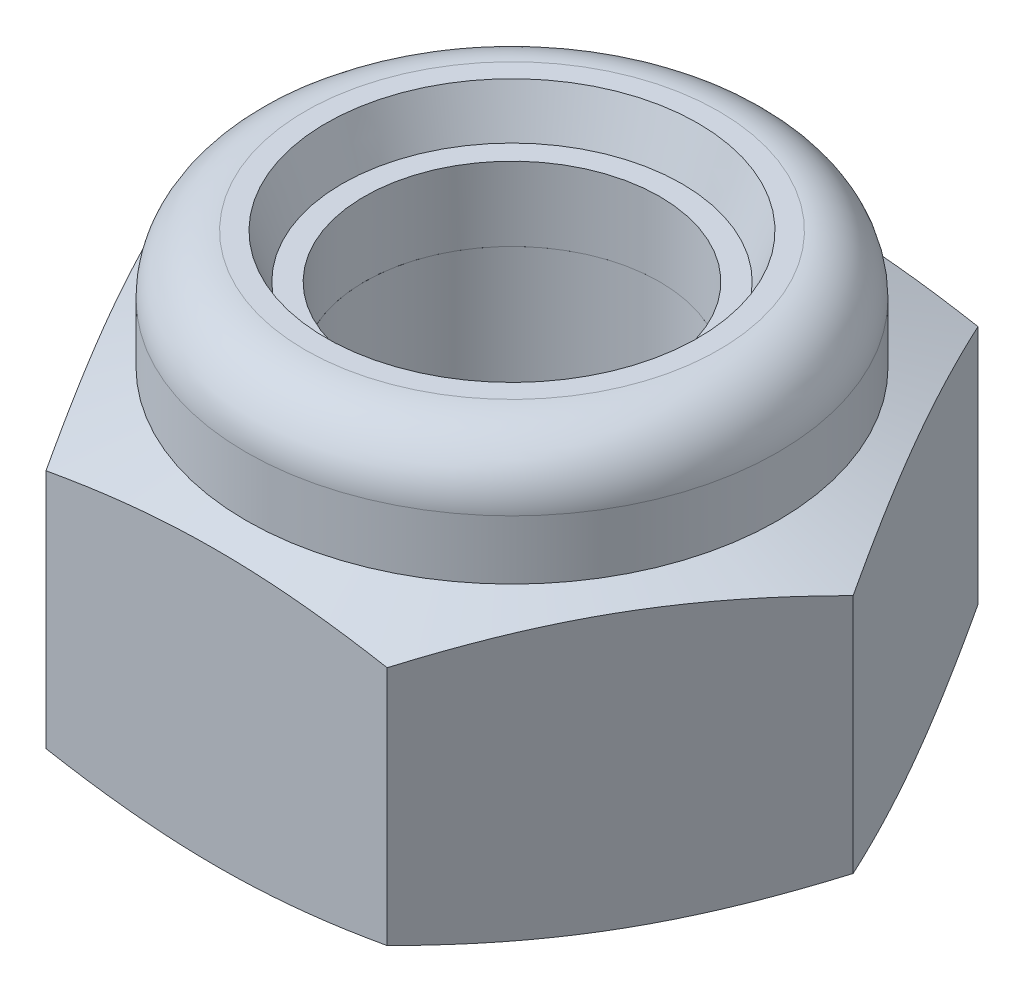
ISO-10303-21;
HEADER;
FILE_DESCRIPTION(('STEP AP214'),'2;1');
FILE_NAME('part.step','',(''),(''),'','','');
FILE_SCHEMA(('AUTOMOTIVE_DESIGN { 1 0 10303 214 1 1 1 1 }'));
ENDSEC;
DATA;
#1=APPLICATION_CONTEXT('core data for automotive mechanical design processes');
#2=APPLICATION_PROTOCOL_DEFINITION('international standard','automotive_design',2000,#1);
#3=PRODUCT_CONTEXT('',#1,'mechanical');
#4=PRODUCT('Part','Part','',(#3));
#5=PRODUCT_RELATED_PRODUCT_CATEGORY('part','',(#4));
#6=PRODUCT_DEFINITION_FORMATION('','',#4);
#7=PRODUCT_DEFINITION_CONTEXT('part definition',#1,'design');
#8=PRODUCT_DEFINITION('design','',#6,#7);
#9=PRODUCT_DEFINITION_SHAPE('','',#8);
#10=(LENGTH_UNIT() NAMED_UNIT(*) SI_UNIT(.MILLI.,.METRE.));
#11=(NAMED_UNIT(*) PLANE_ANGLE_UNIT() SI_UNIT($,.RADIAN.));
#12=(NAMED_UNIT(*) SI_UNIT($,.STERADIAN.) SOLID_ANGLE_UNIT());
#13=UNCERTAINTY_MEASURE_WITH_UNIT(LENGTH_MEASURE(1.E-05),#10,'distance_accuracy_value','');
#14=(GEOMETRIC_REPRESENTATION_CONTEXT(3) GLOBAL_UNCERTAINTY_ASSIGNED_CONTEXT((#13)) GLOBAL_UNIT_ASSIGNED_CONTEXT((#10,
#11,#12)) REPRESENTATION_CONTEXT('',''));
#15=CARTESIAN_POINT('',(0.,0.,0.));
#16=DIRECTION('',(0.,0.,1.));
#17=DIRECTION('',(1.,0.,0.));
#18=AXIS2_PLACEMENT_3D('',#15,#16,#17);
#19=CARTESIAN_POINT('',(0.,2.,0.));
#20=DIRECTION('',(0.,1.,0.));
#21=DIRECTION('',(0.,0.,1.));
#22=AXIS2_PLACEMENT_3D('',#19,#20,#21);
#23=PLANE('',#22);
#24=CARTESIAN_POINT('',(0.,2.,0.));
#25=DIRECTION('',(0.,1.,0.));
#26=DIRECTION('',(0.,0.,1.));
#27=AXIS2_PLACEMENT_3D('',#24,#25,#26);
#28=CIRCLE('',#27,1.3);
#29=CARTESIAN_POINT('',(0.,2.,1.3));
#30=VERTEX_POINT('',#29);
#31=EDGE_CURVE('E56',#30,#30,#28,.T.);
#32=ORIENTED_EDGE('',*,*,#31,.F.);
#33=EDGE_LOOP('',(#32));
#34=FACE_BOUND('',#33,.T.);
#35=CARTESIAN_POINT('',(0.,2.,0.));
#36=DIRECTION('',(0.,1.,0.));
#37=DIRECTION('',(0.,0.,1.));
#38=AXIS2_PLACEMENT_3D('',#35,#36,#37);
#39=CIRCLE('',#38,1.);
#40=CARTESIAN_POINT('',(0.,2.,1.));
#41=VERTEX_POINT('',#40);
#42=EDGE_CURVE('E65',#41,#41,#39,.T.);
#43=ORIENTED_EDGE('',*,*,#42,.T.);
#44=EDGE_LOOP('',(#43));
#45=FACE_BOUND('',#44,.T.);
#46=ADVANCED_FACE('F49',(#34,#45),#23,.F.);
#47=CARTESIAN_POINT('',(0.,6.17695526217005,0.));
#48=DIRECTION('',(0.,-1.,0.));
#49=DIRECTION('',(0.,0.,-1.));
#50=AXIS2_PLACEMENT_3D('',#47,#48,#49);
#51=CYLINDRICAL_SURFACE('',#50,1.3);
#52=CARTESIAN_POINT('',(0.,2.5,0.));
#53=DIRECTION('',(0.,-1.,0.));
#54=DIRECTION('',(0.,0.,-1.));
#55=AXIS2_PLACEMENT_3D('',#52,#53,#54);
#56=CIRCLE('',#55,1.3);
#57=CARTESIAN_POINT('',(0.,2.5,-1.3));
#58=VERTEX_POINT('',#57);
#59=EDGE_CURVE('E60',#58,#58,#56,.T.);
#60=ORIENTED_EDGE('',*,*,#59,.T.);
#61=EDGE_LOOP('',(#60));
#62=FACE_BOUND('',#61,.T.);
#63=ORIENTED_EDGE('',*,*,#31,.T.);
#64=EDGE_LOOP('',(#63));
#65=FACE_BOUND('',#64,.T.);
#66=ADVANCED_FACE('F73',(#62,#65),#51,.T.);
#67=CARTESIAN_POINT('',(0.,6.17695526217005,0.));
#68=DIRECTION('',(0.,-1.,0.));
#69=DIRECTION('',(0.,0.,-1.));
#70=AXIS2_PLACEMENT_3D('',#67,#68,#69);
#71=CYLINDRICAL_SURFACE('',#70,1.);
#72=CARTESIAN_POINT('',(0.,2.5,0.));
#73=DIRECTION('',(0.,-1.,0.));
#74=DIRECTION('',(0.,0.,-1.));
#75=AXIS2_PLACEMENT_3D('',#72,#73,#74);
#76=CIRCLE('',#75,1.);
#77=CARTESIAN_POINT('',(0.,2.5,-1.));
#78=VERTEX_POINT('',#77);
#79=EDGE_CURVE('E11',#78,#78,#76,.T.);
#80=ORIENTED_EDGE('',*,*,#79,.F.);
#81=EDGE_LOOP('',(#80));
#82=FACE_BOUND('',#81,.T.);
#83=ORIENTED_EDGE('',*,*,#42,.F.);
#84=EDGE_LOOP('',(#83));
#85=FACE_BOUND('',#84,.T.);
#86=ADVANCED_FACE('F71',(#82,#85),#71,.F.);
#87=CARTESIAN_POINT('',(1.3,2.5,0.));
#88=DIRECTION('',(0.,-1.,0.));
#89=DIRECTION('',(0.,0.,-1.));
#90=AXIS2_PLACEMENT_3D('',#87,#88,#89);
#91=PLANE('',#90);
#92=ORIENTED_EDGE('',*,*,#79,.T.);
#93=EDGE_LOOP('',(#92));
#94=FACE_BOUND('',#93,.T.);
#95=ORIENTED_EDGE('',*,*,#59,.F.);
#96=EDGE_LOOP('',(#95));
#97=FACE_BOUND('',#96,.T.);
#98=ADVANCED_FACE('F51',(#94,#97),#91,.F.);
#99=CLOSED_SHELL('',(#46,#66,#86,#98));
#100=MANIFOLD_SOLID_BREP('B2',#99);
#101=CARTESIAN_POINT('',(0.,0.173205080756889,0.));
#102=DIRECTION('',(0.,-1.,0.));
#103=DIRECTION('',(0.,0.,-1.));
#104=AXIS2_PLACEMENT_3D('',#101,#102,#103);
#105=CONICAL_SURFACE('',#104,1.,1.04719755119659);
#106=CARTESIAN_POINT('',(0.,0.,0.));
#107=DIRECTION('',(0.,-1.,0.));
#108=DIRECTION('',(0.,0.,-1.));
#109=AXIS2_PLACEMENT_3D('',#106,#107,#108);
#110=CIRCLE('',#109,1.3);
#111=CARTESIAN_POINT('',(0.,0.,-1.3));
#112=VERTEX_POINT('',#111);
#113=EDGE_CURVE('E220',#112,#112,#110,.T.);
#114=ORIENTED_EDGE('',*,*,#113,.T.);
#115=EDGE_LOOP('',(#114));
#116=FACE_BOUND('',#115,.T.);
#117=CARTESIAN_POINT('',(0.,0.173205080756889,0.));
#118=DIRECTION('',(0.,-1.,0.));
#119=DIRECTION('',(0.,0.,-1.));
#120=AXIS2_PLACEMENT_3D('',#117,#118,#119);
#121=CIRCLE('',#120,1.);
#122=CARTESIAN_POINT('',(0.,0.173205080756889,-1.));
#123=VERTEX_POINT('',#122);
#124=EDGE_CURVE('E191',#123,#123,#121,.T.);
#125=ORIENTED_EDGE('',*,*,#124,.F.);
#126=EDGE_LOOP('',(#125));
#127=FACE_BOUND('',#126,.T.);
#128=ADVANCED_FACE('F111',(#116,#127),#105,.F.);
#129=CARTESIAN_POINT('',(1.3,0.,0.));
#130=DIRECTION('',(0.,-1.,0.));
#131=DIRECTION('',(0.,0.,-1.));
#132=AXIS2_PLACEMENT_3D('',#129,#130,#131);
#133=PLANE('',#132);
#134=CARTESIAN_POINT('',(0.,0.,0.));
#135=DIRECTION('',(0.,-1.,0.));
#136=DIRECTION('',(0.,0.,-1.));
#137=AXIS2_PLACEMENT_3D('',#134,#135,#136);
#138=CIRCLE('',#137,1.8);
#139=CARTESIAN_POINT('',(0.,0.,-1.8));
#140=VERTEX_POINT('',#139);
#141=EDGE_CURVE('E314',#140,#140,#138,.T.);
#142=ORIENTED_EDGE('',*,*,#141,.T.);
#143=EDGE_LOOP('',(#142));
#144=FACE_BOUND('',#143,.T.);
#145=ORIENTED_EDGE('',*,*,#113,.F.);
#146=EDGE_LOOP('',(#145));
#147=FACE_BOUND('',#146,.T.);
#148=ADVANCED_FACE('F321',(#144,#147),#133,.T.);
#149=CARTESIAN_POINT('',(0.,-0.041635430402974,0.));
#150=DIRECTION('',(0.,-1.,0.));
#151=DIRECTION('',(0.,0.,-1.));
#152=AXIS2_PLACEMENT_3D('',#149,#150,#151);
#153=CYLINDRICAL_SURFACE('',#152,1.8);
#154=CARTESIAN_POINT('',(0.,2.,0.));
#155=DIRECTION('',(0.,-1.,0.));
#156=DIRECTION('',(0.,0.,-1.));
#157=AXIS2_PLACEMENT_3D('',#154,#155,#156);
#158=CIRCLE('',#157,1.8);
#159=CARTESIAN_POINT('',(0.,2.,-1.8));
#160=VERTEX_POINT('',#159);
#161=EDGE_CURVE('E312',#160,#160,#158,.T.);
#162=ORIENTED_EDGE('',*,*,#161,.F.);
#163=EDGE_LOOP('',(#162));
#164=FACE_BOUND('',#163,.T.);
#165=CARTESIAN_POINT('',(0.,2.4,0.));
#166=DIRECTION('',(0.,-1.,0.));
#167=DIRECTION('',(0.,0.,-1.));
#168=AXIS2_PLACEMENT_3D('',#165,#166,#167);
#169=CIRCLE('',#168,1.8);
#170=CARTESIAN_POINT('',(0.,2.4,-1.8));
#171=VERTEX_POINT('',#170);
#172=EDGE_CURVE('E217',#171,#171,#169,.T.);
#173=ORIENTED_EDGE('',*,*,#172,.T.);
#174=EDGE_LOOP('',(#173));
#175=FACE_BOUND('',#174,.T.);
#176=ADVANCED_FACE('F324',(#164,#175),#153,.T.);
#177=CARTESIAN_POINT('',(0.,2.4,0.));
#178=DIRECTION('',(0.,-1.,0.));
#179=DIRECTION('',(0.,0.,-1.));
#180=AXIS2_PLACEMENT_3D('',#177,#178,#179);
#181=TOROIDAL_SURFACE('',#180,1.4,0.4);
#182=CARTESIAN_POINT('',(0.,2.8,0.));
#183=DIRECTION('',(0.,-1.,0.));
#184=DIRECTION('',(0.,0.,-1.));
#185=AXIS2_PLACEMENT_3D('',#182,#183,#184);
#186=CIRCLE('',#185,1.4);
#187=CARTESIAN_POINT('',(0.,2.8,-1.4));
#188=VERTEX_POINT('',#187);
#189=EDGE_CURVE('E214',#188,#188,#186,.T.);
#190=ORIENTED_EDGE('',*,*,#189,.T.);
#191=EDGE_LOOP('',(#190));
#192=FACE_BOUND('',#191,.T.);
#193=ORIENTED_EDGE('',*,*,#172,.F.);
#194=EDGE_LOOP('',(#193));
#195=FACE_BOUND('',#194,.T.);
#196=ADVANCED_FACE('F362',(#192,#195),#181,.T.);
#197=CARTESIAN_POINT('',(1.4,2.8,0.));
#198=DIRECTION('',(0.,1.,0.));
#199=DIRECTION('',(0.,0.,1.));
#200=AXIS2_PLACEMENT_3D('',#197,#198,#199);
#201=PLANE('',#200);
#202=CARTESIAN_POINT('',(0.,2.8,0.));
#203=DIRECTION('',(0.,-1.,0.));
#204=DIRECTION('',(0.,0.,-1.));
#205=AXIS2_PLACEMENT_3D('',#202,#203,#204);
#206=CIRCLE('',#205,1.25919107027986);
#207=CARTESIAN_POINT('',(0.,2.8,-1.25919107027986));
#208=VERTEX_POINT('',#207);
#209=EDGE_CURVE('E211',#208,#208,#206,.T.);
#210=ORIENTED_EDGE('',*,*,#209,.T.);
#211=EDGE_LOOP('',(#210));
#212=FACE_BOUND('',#211,.T.);
#213=ORIENTED_EDGE('',*,*,#189,.F.);
#214=EDGE_LOOP('',(#213));
#215=FACE_BOUND('',#214,.T.);
#216=ADVANCED_FACE('F356',(#212,#215),#201,.T.);
#217=CARTESIAN_POINT('',(0.,2.8,0.));
#218=DIRECTION('',(0.,1.,0.));
#219=DIRECTION('',(0.,0.,1.));
#220=AXIS2_PLACEMENT_3D('',#217,#218,#219);
#221=CONICAL_SURFACE('',#220,1.25919107027986,0.349065850398862);
#222=CARTESIAN_POINT('',(0.,2.5,0.));
#223=DIRECTION('',(0.,-1.,0.));
#224=DIRECTION('',(0.,0.,-1.));
#225=AXIS2_PLACEMENT_3D('',#222,#223,#224);
#226=CIRCLE('',#225,1.15);
#227=CARTESIAN_POINT('',(0.,2.5,-1.15));
#228=VERTEX_POINT('',#227);
#229=EDGE_CURVE('E208',#228,#228,#226,.T.);
#230=ORIENTED_EDGE('',*,*,#229,.T.);
#231=EDGE_LOOP('',(#230));
#232=FACE_BOUND('',#231,.T.);
#233=ORIENTED_EDGE('',*,*,#209,.F.);
#234=EDGE_LOOP('',(#233));
#235=FACE_BOUND('',#234,.T.);
#236=ADVANCED_FACE('F350',(#232,#235),#221,.F.);
#237=CARTESIAN_POINT('',(1.3,2.5,0.));
#238=DIRECTION('',(0.,-1.,0.));
#239=DIRECTION('',(0.,0.,-1.));
#240=AXIS2_PLACEMENT_3D('',#237,#238,#239);
#241=PLANE('',#240);
#242=CARTESIAN_POINT('',(0.,2.5,0.));
#243=DIRECTION('',(0.,-1.,0.));
#244=DIRECTION('',(0.,0.,-1.));
#245=AXIS2_PLACEMENT_3D('',#242,#243,#244);
#246=CIRCLE('',#245,1.3);
#247=CARTESIAN_POINT('',(0.,2.5,-1.3));
#248=VERTEX_POINT('',#247);
#249=EDGE_CURVE('E205',#248,#248,#246,.T.);
#250=ORIENTED_EDGE('',*,*,#249,.T.);
#251=EDGE_LOOP('',(#250));
#252=FACE_BOUND('',#251,.T.);
#253=ORIENTED_EDGE('',*,*,#229,.F.);
#254=EDGE_LOOP('',(#253));
#255=FACE_BOUND('',#254,.T.);
#256=ADVANCED_FACE('F344',(#252,#255),#241,.T.);
#257=CARTESIAN_POINT('',(0.,-0.041635430402974,0.));
#258=DIRECTION('',(0.,-1.,0.));
#259=DIRECTION('',(0.,0.,-1.));
#260=AXIS2_PLACEMENT_3D('',#257,#258,#259);
#261=CYLINDRICAL_SURFACE('',#260,1.3);
#262=CARTESIAN_POINT('',(0.,2.,0.));
#263=DIRECTION('',(0.,-1.,0.));
#264=DIRECTION('',(0.,0.,-1.));
#265=AXIS2_PLACEMENT_3D('',#262,#263,#264);
#266=CIRCLE('',#265,1.3);
#267=CARTESIAN_POINT('',(0.,2.,-1.3));
#268=VERTEX_POINT('',#267);
#269=EDGE_CURVE('E202',#268,#268,#266,.T.);
#270=ORIENTED_EDGE('',*,*,#269,.T.);
#271=EDGE_LOOP('',(#270));
#272=FACE_BOUND('',#271,.T.);
#273=ORIENTED_EDGE('',*,*,#249,.F.);
#274=EDGE_LOOP('',(#273));
#275=FACE_BOUND('',#274,.T.);
#276=ADVANCED_FACE('F338',(#272,#275),#261,.F.);
#277=CARTESIAN_POINT('',(1.,2.,0.));
#278=DIRECTION('',(0.,1.,0.));
#279=DIRECTION('',(0.,0.,1.));
#280=AXIS2_PLACEMENT_3D('',#277,#278,#279);
#281=PLANE('',#280);
#282=CARTESIAN_POINT('',(0.,2.,0.));
#283=DIRECTION('',(0.,-1.,0.));
#284=DIRECTION('',(0.,0.,-1.));
#285=AXIS2_PLACEMENT_3D('',#282,#283,#284);
#286=CIRCLE('',#285,1.);
#287=CARTESIAN_POINT('',(0.,2.,-1.));
#288=VERTEX_POINT('',#287);
#289=EDGE_CURVE('E199',#288,#288,#286,.T.);
#290=ORIENTED_EDGE('',*,*,#289,.T.);
#291=EDGE_LOOP('',(#290));
#292=FACE_BOUND('',#291,.T.);
#293=ORIENTED_EDGE('',*,*,#269,.F.);
#294=EDGE_LOOP('',(#293));
#295=FACE_BOUND('',#294,.T.);
#296=ADVANCED_FACE('F333',(#292,#295),#281,.T.);
#297=CARTESIAN_POINT('',(0.,-0.041635430402974,0.));
#298=DIRECTION('',(0.,-1.,0.));
#299=DIRECTION('',(0.,0.,-1.));
#300=AXIS2_PLACEMENT_3D('',#297,#298,#299);
#301=CYLINDRICAL_SURFACE('',#300,1.);
#302=ORIENTED_EDGE('',*,*,#124,.T.);
#303=EDGE_LOOP('',(#302));
#304=FACE_BOUND('',#303,.T.);
#305=ORIENTED_EDGE('',*,*,#289,.F.);
#306=EDGE_LOOP('',(#305));
#307=FACE_BOUND('',#306,.T.);
#308=ADVANCED_FACE('F233',(#304,#307),#301,.F.);
#309=CARTESIAN_POINT('',(0.,0.,0.));
#310=DIRECTION('',(0.,1.,0.));
#311=DIRECTION('',(0.,0.,1.));
#312=AXIS2_PLACEMENT_3D('',#309,#310,#311);
#313=CONICAL_SURFACE('',#312,1.8,1.22173047639604);
#314=ORIENTED_EDGE('',*,*,#141,.F.);
#315=EDGE_LOOP('',(#314));
#316=FACE_BOUND('',#315,.T.);
#317=CARTESIAN_POINT('',(2.30951654681234,0.185448860057707,-0.000200000000000235));
#318=CARTESIAN_POINT('',(2.26168836191613,0.168032497453668,0.0826408462740325));
#319=CARTESIAN_POINT('',(2.213702437291,0.152189163754237,0.165754905772934));
#320=CARTESIAN_POINT('',(2.11741850917833,0.124315100500139,0.332523561216389));
#321=CARTESIAN_POINT('',(2.06912029137895,0.112287355790318,0.416178528359942));
#322=CARTESIAN_POINT('',(1.97274789994999,0.092832762508844,0.583100406761807));
#323=CARTESIAN_POINT('',(1.92467592830622,0.0853634711754722,0.666363504068834));
#324=CARTESIAN_POINT('',(1.82841954097686,0.0753450362594954,0.833084457476315));
#325=CARTESIAN_POINT('',(1.78023517427287,0.0727940468532388,0.916542228738157));
#326=CARTESIAN_POINT('',(1.68386644086489,0.0727940468532389,1.08345777126184));
#327=CARTESIAN_POINT('',(1.63568207416089,0.0753450362594954,1.16691554252369));
#328=CARTESIAN_POINT('',(1.53942568683153,0.0853634711754723,1.33363649593117));
#329=CARTESIAN_POINT('',(1.49135371518776,0.0928327625088441,1.41689959323819));
#330=CARTESIAN_POINT('',(1.39498132375881,0.112287355790318,1.58382147164006));
#331=CARTESIAN_POINT('',(1.34668310595943,0.124315100500139,1.66747643878361));
#332=CARTESIAN_POINT('',(1.25039917784676,0.152189163754237,1.83424509422707));
#333=CARTESIAN_POINT('',(1.20241325322162,0.168032497453668,1.91735915372597));
#334=CARTESIAN_POINT('',(1.15458506832541,0.185448860057707,2.0002));
#335=B_SPLINE_CURVE_WITH_KNOTS('',3,(#317,#318,#319,#320,#321,#322,#323,#324,#325,#326,#327,
#328,#329,#330,#331,#332,#333,#334),.UNSPECIFIED.,.F.,.F.,(4,2,2,2,2,2,2,2,4),(0.,
0.291716985835478,0.583661615412808,0.872844804843114,1.16191944356588,1.45099408228865,
1.74017727171896,2.03212190129629,2.32383888713177),.UNSPECIFIED.);
#336=CARTESIAN_POINT('',(2.3094010767585,0.185406829243244,0.));
#337=VERTEX_POINT('',#336);
#338=CARTESIAN_POINT('',(1.15470053837925,0.185406829243244,2.));
#339=VERTEX_POINT('',#338);
#340=EDGE_CURVE('E138',#337,#339,#335,.T.);
#341=ORIENTED_EDGE('',*,*,#340,.T.);
#342=CARTESIAN_POINT('',(3.47173221669845,0.803140399166297,2.));
#343=CARTESIAN_POINT('',(3.33467613121465,0.759947162321743,2.));
#344=CARTESIAN_POINT('',(3.19744874625352,0.717277491965518,2.));
#345=CARTESIAN_POINT('',(2.92248766846374,0.633488248677123,2.));
#346=CARTESIAN_POINT('',(2.78475386515635,0.592369039088497,2.));
#347=CARTESIAN_POINT('',(2.50664175666766,0.511612437333617,2.));
#348=CARTESIAN_POINT('',(2.36625443302725,0.472005890151682,2.));
#349=CARTESIAN_POINT('',(2.0846705697637,0.395774488997391,2.));
#350=CARTESIAN_POINT('',(1.94347406124966,0.35914952121054,2.));
#351=CARTESIAN_POINT('',(1.66609465454319,0.291575959371943,2.));
#352=CARTESIAN_POINT('',(1.52995507786675,0.260451776394293,2.));
#353=CARTESIAN_POINT('',(1.25652603151644,0.203567415622111,2.));
#354=CARTESIAN_POINT('',(1.11923648418539,0.177807603169635,2.));
#355=CARTESIAN_POINT('',(0.844526523019972,0.133768386727709,2.));
#356=CARTESIAN_POINT('',(0.707115453051057,0.115432295019935,2.));
#357=CARTESIAN_POINT('',(0.431372927201322,0.0879778260971191,2.));
#358=CARTESIAN_POINT('',(0.29304181325693,0.0788561980597132,2.));
#359=CARTESIAN_POINT('',(0.0791834834947815,0.0728462435110047,2.));
#360=CARTESIAN_POINT('',(0.00374797291731438,0.0722783357586366,2.));
#361=CARTESIAN_POINT('',(-0.147083205076488,0.0742441786272887,2.));
#362=CARTESIAN_POINT('',(-0.222478871967159,0.0767779691955004,2.));
#363=CARTESIAN_POINT('',(-0.448456806251435,0.088903246236047,2.));
#364=CARTESIAN_POINT('',(-0.598808340004978,0.103019208012281,2.));
#365=CARTESIAN_POINT('',(-0.899437498735875,0.141345236994268,2.));
#366=CARTESIAN_POINT('',(-1.04970372350262,0.165639742878242,2.));
#367=CARTESIAN_POINT('',(-1.34882682025645,0.221626645184326,2.));
#368=CARTESIAN_POINT('',(-1.49768357088253,0.253319672726676,2.));
#369=CARTESIAN_POINT('',(-1.80131712266014,0.323543274396797,2.));
#370=CARTESIAN_POINT('',(-1.95603361202946,0.362329710661875,2.));
#371=CARTESIAN_POINT('',(-2.26442023888771,0.443801944133915,2.));
#372=CARTESIAN_POINT('',(-2.41809039616951,0.486487667358786,2.));
#373=CARTESIAN_POINT('',(-2.72208862418641,0.573821061236172,2.));
#374=CARTESIAN_POINT('',(-2.87242964458293,0.618424051180898,2.));
#375=CARTESIAN_POINT('',(-3.17249136157713,0.709529321161622,2.));
#376=CARTESIAN_POINT('',(-3.32221221798604,0.756031073401701,2.));
#377=CARTESIAN_POINT('',(-3.47173221669845,0.803140399166297,2.));
#378=B_SPLINE_CURVE_WITH_KNOTS('',3,(#342,#343,#344,#345,#346,#347,#348,#349,#350,#351,#352,
#353,#354,#355,#356,#357,#358,#359,#360,#361,#362,#363,#364,#365,#366,#367,#368,#369,#370,#371,
#372,#373,#374,#375,#376,#377),.UNSPECIFIED.,.F.,.F.,(4,2,2,2,2,2,2,2,2,2,2,2,2,2,2,2,2,4),(0.,
0.431111535628822,0.862323480250776,1.29990254873577,1.73746490587111,2.15634580443996,
2.57525522169428,2.9909026040463,3.4064032965589,3.63265718312961,3.85891398368533,
4.31149240829013,4.76790207331035,5.22435068593603,5.70279081907759,6.18122187654652,
6.65166150220938,7.12197123905511),.UNSPECIFIED.);
#379=CARTESIAN_POINT('',(-1.15470053837925,0.185406829243244,2.));
#380=VERTEX_POINT('',#379);
#381=EDGE_CURVE('E124',#339,#380,#378,.T.);
#382=ORIENTED_EDGE('',*,*,#381,.T.);
#383=CARTESIAN_POINT('',(-1.15458506832541,0.185448860057707,2.0002));
#384=CARTESIAN_POINT('',(-1.20241325322162,0.168032497453668,1.91735915372597));
#385=CARTESIAN_POINT('',(-1.25039917784676,0.152189163754237,1.83424509422707));
#386=CARTESIAN_POINT('',(-1.34668310595943,0.124315100500139,1.66747643878361));
#387=CARTESIAN_POINT('',(-1.39498132375881,0.112287355790318,1.58382147164006));
#388=CARTESIAN_POINT('',(-1.49135371518776,0.0928327625088439,1.41689959323819));
#389=CARTESIAN_POINT('',(-1.53942568683153,0.0853634711754721,1.33363649593117));
#390=CARTESIAN_POINT('',(-1.63568207416089,0.0753450362594954,1.16691554252369));
#391=CARTESIAN_POINT('',(-1.68386644086489,0.0727940468532389,1.08345777126184));
#392=CARTESIAN_POINT('',(-1.78023517427287,0.0727940468532389,0.916542228738157));
#393=CARTESIAN_POINT('',(-1.82841954097686,0.0753450362594954,0.833084457476314));
#394=CARTESIAN_POINT('',(-1.92467592830622,0.0853634711754723,0.666363504068834));
#395=CARTESIAN_POINT('',(-1.97274789994999,0.0928327625088441,0.583100406761806));
#396=CARTESIAN_POINT('',(-2.06912029137895,0.112287355790318,0.416178528359942));
#397=CARTESIAN_POINT('',(-2.11741850917833,0.124315100500139,0.332523561216389));
#398=CARTESIAN_POINT('',(-2.213702437291,0.152189163754237,0.165754905772934));
#399=CARTESIAN_POINT('',(-2.26168836191613,0.168032497453668,0.0826408462740324));
#400=CARTESIAN_POINT('',(-2.30951654681234,0.185448860057708,-0.000200000000000482));
#401=B_SPLINE_CURVE_WITH_KNOTS('',3,(#383,#384,#385,#386,#387,#388,#389,#390,#391,#392,#393,
#394,#395,#396,#397,#398,#399,#400),.UNSPECIFIED.,.F.,.F.,(4,2,2,2,2,2,2,2,4),(0.,
0.291716985835479,0.583661615412808,0.872844804843115,1.16191944356588,1.45099408228865,
1.74017727171896,2.03212190129629,2.32383888713177),.UNSPECIFIED.);
#402=CARTESIAN_POINT('',(-2.3094010767585,0.185406829243244,0.));
#403=VERTEX_POINT('',#402);
#404=EDGE_CURVE('E242',#380,#403,#401,.T.);
#405=ORIENTED_EDGE('',*,*,#404,.T.);
#406=CARTESIAN_POINT('',(-2.30951654681234,0.185448860057708,0.000199999999999979));
#407=CARTESIAN_POINT('',(-2.26168836191613,0.168032497453668,-0.0826408462740328));
#408=CARTESIAN_POINT('',(-2.213702437291,0.152189163754237,-0.165754905772935));
#409=CARTESIAN_POINT('',(-2.11741850917833,0.124315100500139,-0.332523561216389));
#410=CARTESIAN_POINT('',(-2.06912029137895,0.112287355790318,-0.416178528359942));
#411=CARTESIAN_POINT('',(-1.97274789994999,0.0928327625088441,-0.583100406761807));
#412=CARTESIAN_POINT('',(-1.92467592830622,0.0853634711754723,-0.666363504068834));
#413=CARTESIAN_POINT('',(-1.82841954097686,0.0753450362594955,-0.833084457476315));
#414=CARTESIAN_POINT('',(-1.78023517427287,0.072794046853239,-0.916542228738157));
#415=CARTESIAN_POINT('',(-1.68386644086489,0.072794046853239,-1.08345777126184));
#416=CARTESIAN_POINT('',(-1.6356820741609,0.0753450362594955,-1.16691554252369));
#417=CARTESIAN_POINT('',(-1.53942568683154,0.0853634711754723,-1.33363649593117));
#418=CARTESIAN_POINT('',(-1.49135371518776,0.0928327625088441,-1.41689959323819));
#419=CARTESIAN_POINT('',(-1.39498132375881,0.112287355790318,-1.58382147164006));
#420=CARTESIAN_POINT('',(-1.34668310595943,0.124315100500139,-1.66747643878361));
#421=CARTESIAN_POINT('',(-1.25039917784676,0.152189163754237,-1.83424509422707));
#422=CARTESIAN_POINT('',(-1.20241325322162,0.168032497453668,-1.91735915372597));
#423=CARTESIAN_POINT('',(-1.15458506832541,0.185448860057707,-2.0002));
#424=B_SPLINE_CURVE_WITH_KNOTS('',3,(#406,#407,#408,#409,#410,#411,#412,#413,#414,#415,#416,
#417,#418,#419,#420,#421,#422,#423),.UNSPECIFIED.,.F.,.F.,(4,2,2,2,2,2,2,2,4),(0.,
0.291716985835478,0.583661615412808,0.872844804843114,1.16191944356588,1.45099408228865,
1.74017727171896,2.03212190129629,2.32383888713177),.UNSPECIFIED.);
#425=CARTESIAN_POINT('',(-1.15470053837925,0.185406829243244,-2.));
#426=VERTEX_POINT('',#425);
#427=EDGE_CURVE('E171',#403,#426,#424,.T.);
#428=ORIENTED_EDGE('',*,*,#427,.T.);
#429=CARTESIAN_POINT('',(-3.47173221669845,0.803140399166297,-2.));
#430=CARTESIAN_POINT('',(-3.33467613121466,0.759947162321744,-2.));
#431=CARTESIAN_POINT('',(-3.19744874625352,0.717277491965519,-2.));
#432=CARTESIAN_POINT('',(-2.92248766846374,0.633488248677123,-2.));
#433=CARTESIAN_POINT('',(-2.78475386515635,0.592369039088497,-2.));
#434=CARTESIAN_POINT('',(-2.50664175666766,0.511612437333616,-2.));
#435=CARTESIAN_POINT('',(-2.36625443302725,0.472005890151682,-2.));
#436=CARTESIAN_POINT('',(-2.0846705697637,0.395774488997391,-2.));
#437=CARTESIAN_POINT('',(-1.94347406124966,0.35914952121054,-2.));
#438=CARTESIAN_POINT('',(-1.66609465454319,0.291575959371943,-2.));
#439=CARTESIAN_POINT('',(-1.52995507786675,0.260451776394293,-2.));
#440=CARTESIAN_POINT('',(-1.25652603151644,0.203567415622111,-2.));
#441=CARTESIAN_POINT('',(-1.11923648418539,0.177807603169635,-2.));
#442=CARTESIAN_POINT('',(-0.844526523019972,0.133768386727709,-2.));
#443=CARTESIAN_POINT('',(-0.707115453051057,0.115432295019935,-2.));
#444=CARTESIAN_POINT('',(-0.431372927201322,0.087977826097119,-2.));
#445=CARTESIAN_POINT('',(-0.29304181325693,0.0788561980597131,-2.));
#446=CARTESIAN_POINT('',(-0.0791834834947811,0.0728462435110046,-2.));
#447=CARTESIAN_POINT('',(-0.00374797291731421,0.0722783357586366,-2.));
#448=CARTESIAN_POINT('',(0.147083205076488,0.0742441786272886,-2.));
#449=CARTESIAN_POINT('',(0.22247887196716,0.0767779691955003,-2.));
#450=CARTESIAN_POINT('',(0.448456806251435,0.088903246236047,-2.));
#451=CARTESIAN_POINT('',(0.598808340004978,0.103019208012281,-2.));
#452=CARTESIAN_POINT('',(0.899437498735875,0.141345236994268,-2.));
#453=CARTESIAN_POINT('',(1.04970372350262,0.165639742878241,-2.));
#454=CARTESIAN_POINT('',(1.34882682025645,0.221626645184326,-2.));
#455=CARTESIAN_POINT('',(1.49768357088253,0.253319672726676,-2.));
#456=CARTESIAN_POINT('',(1.80131712266014,0.323543274396797,-2.));
#457=CARTESIAN_POINT('',(1.95603361202946,0.362329710661875,-2.));
#458=CARTESIAN_POINT('',(2.26442023888771,0.443801944133915,-2.));
#459=CARTESIAN_POINT('',(2.41809039616951,0.486487667358786,-2.));
#460=CARTESIAN_POINT('',(2.72208862418641,0.573821061236173,-2.));
#461=CARTESIAN_POINT('',(2.87242964458293,0.618424051180899,-2.));
#462=CARTESIAN_POINT('',(3.17249136157713,0.709529321161623,-2.));
#463=CARTESIAN_POINT('',(3.32221221798604,0.756031073401701,-2.));
#464=CARTESIAN_POINT('',(3.47173221669845,0.803140399166297,-2.));
#465=B_SPLINE_CURVE_WITH_KNOTS('',3,(#429,#430,#431,#432,#433,#434,#435,#436,#437,#438,#439,
#440,#441,#442,#443,#444,#445,#446,#447,#448,#449,#450,#451,#452,#453,#454,#455,#456,#457,#458,
#459,#460,#461,#462,#463,#464),.UNSPECIFIED.,.F.,.F.,(4,2,2,2,2,2,2,2,2,2,2,2,2,2,2,2,2,4),(0.,
0.431111535628823,0.862323480250777,1.29990254873577,1.73746490587111,2.15634580443996,
2.57525522169429,2.9909026040463,3.4064032965589,3.63265718312961,3.85891398368533,
4.31149240829013,4.76790207331035,5.22435068593603,5.70279081907759,6.18122187654652,
6.65166150220938,7.12197123905511),.UNSPECIFIED.);
#466=CARTESIAN_POINT('',(1.15470053837925,0.185406829243244,-2.));
#467=VERTEX_POINT('',#466);
#468=EDGE_CURVE('E166',#426,#467,#465,.T.);
#469=ORIENTED_EDGE('',*,*,#468,.T.);
#470=CARTESIAN_POINT('',(1.15458506832541,0.185448860057707,-2.0002));
#471=CARTESIAN_POINT('',(1.20241325322162,0.168032497453668,-1.91735915372597));
#472=CARTESIAN_POINT('',(1.25039917784676,0.152189163754237,-1.83424509422707));
#473=CARTESIAN_POINT('',(1.34668310595943,0.124315100500139,-1.66747643878361));
#474=CARTESIAN_POINT('',(1.39498132375881,0.112287355790318,-1.58382147164006));
#475=CARTESIAN_POINT('',(1.49135371518776,0.092832762508844,-1.41689959323819));
#476=CARTESIAN_POINT('',(1.53942568683154,0.0853634711754723,-1.33363649593117));
#477=CARTESIAN_POINT('',(1.6356820741609,0.0753450362594955,-1.16691554252369));
#478=CARTESIAN_POINT('',(1.68386644086489,0.072794046853239,-1.08345777126184));
#479=CARTESIAN_POINT('',(1.78023517427287,0.072794046853239,-0.916542228738157));
#480=CARTESIAN_POINT('',(1.82841954097686,0.0753450362594955,-0.833084457476314));
#481=CARTESIAN_POINT('',(1.92467592830622,0.0853634711754723,-0.666363504068834));
#482=CARTESIAN_POINT('',(1.97274789994999,0.0928327625088442,-0.583100406761806));
#483=CARTESIAN_POINT('',(2.06912029137895,0.112287355790318,-0.416178528359942));
#484=CARTESIAN_POINT('',(2.11741850917833,0.124315100500139,-0.332523561216389));
#485=CARTESIAN_POINT('',(2.213702437291,0.152189163754237,-0.165754905772934));
#486=CARTESIAN_POINT('',(2.26168836191613,0.168032497453668,-0.0826408462740322));
#487=CARTESIAN_POINT('',(2.30951654681234,0.185448860057708,0.000200000000000388));
#488=B_SPLINE_CURVE_WITH_KNOTS('',3,(#470,#471,#472,#473,#474,#475,#476,#477,#478,#479,#480,
#481,#482,#483,#484,#485,#486,#487),.UNSPECIFIED.,.F.,.F.,(4,2,2,2,2,2,2,2,4),(0.,
0.291716985835479,0.583661615412808,0.872844804843115,1.16191944356588,1.45099408228865,
1.74017727171896,2.03212190129629,2.32383888713177),.UNSPECIFIED.);
#489=EDGE_CURVE('E169',#467,#337,#488,.T.);
#490=ORIENTED_EDGE('',*,*,#489,.T.);
#491=EDGE_LOOP('',(#341,#382,#405,#428,#469,#490));
#492=FACE_BOUND('',#491,.T.);
#493=ADVANCED_FACE('F168',(#316,#492),#313,.T.);
#494=CARTESIAN_POINT('',(0.,1.81459317075676,0.));
#495=DIRECTION('',(0.,-1.,0.));
#496=DIRECTION('',(0.,0.,-1.));
#497=AXIS2_PLACEMENT_3D('',#494,#495,#496);
#498=CONICAL_SURFACE('',#497,2.3094010767585,1.22173047639604);
#499=ORIENTED_EDGE('',*,*,#161,.T.);
#500=EDGE_LOOP('',(#499));
#501=FACE_BOUND('',#500,.T.);
#502=CARTESIAN_POINT('',(1.15458506832541,1.81455113994229,2.0002));
#503=CARTESIAN_POINT('',(1.20241325322162,1.83196750254633,1.91735915372597));
#504=CARTESIAN_POINT('',(1.25039917784676,1.84781083624576,1.83424509422707));
#505=CARTESIAN_POINT('',(1.34668310595943,1.87568489949986,1.66747643878361));
#506=CARTESIAN_POINT('',(1.39498132375881,1.88771264420968,1.58382147164006));
#507=CARTESIAN_POINT('',(1.49135371518776,1.90716723749116,1.41689959323819));
#508=CARTESIAN_POINT('',(1.53942568683154,1.91463652882453,1.33363649593117));
#509=CARTESIAN_POINT('',(1.63568207416089,1.9246549637405,1.16691554252369));
#510=CARTESIAN_POINT('',(1.68386644086489,1.92720595314676,1.08345777126184));
#511=CARTESIAN_POINT('',(1.78023517427287,1.92720595314676,0.916542228738157));
#512=CARTESIAN_POINT('',(1.82841954097686,1.9246549637405,0.833084457476314));
#513=CARTESIAN_POINT('',(1.92467592830622,1.91463652882453,0.666363504068834));
#514=CARTESIAN_POINT('',(1.97274789994999,1.90716723749116,0.583100406761807));
#515=CARTESIAN_POINT('',(2.06912029137895,1.88771264420968,0.416178528359942));
#516=CARTESIAN_POINT('',(2.11741850917833,1.87568489949986,0.332523561216389));
#517=CARTESIAN_POINT('',(2.213702437291,1.84781083624576,0.165754905772934));
#518=CARTESIAN_POINT('',(2.26168836191613,1.83196750254633,0.0826408462740323));
#519=CARTESIAN_POINT('',(2.30951654681234,1.81455113994229,-0.000200000000000385));
#520=B_SPLINE_CURVE_WITH_KNOTS('',3,(#502,#503,#504,#505,#506,#507,#508,#509,#510,#511,#512,
#513,#514,#515,#516,#517,#518,#519),.UNSPECIFIED.,.F.,.F.,(4,2,2,2,2,2,2,2,4),(0.,
0.291716985835479,0.583661615412809,0.872844804843115,1.16191944356588,1.45099408228865,
1.74017727171896,2.03212190129629,2.32383888713177),.UNSPECIFIED.);
#521=CARTESIAN_POINT('',(1.15470053837925,1.81459317075676,2.));
#522=VERTEX_POINT('',#521);
#523=CARTESIAN_POINT('',(2.3094010767585,1.81459317075676,0.));
#524=VERTEX_POINT('',#523);
#525=EDGE_CURVE('E286',#522,#524,#520,.T.);
#526=ORIENTED_EDGE('',*,*,#525,.T.);
#527=CARTESIAN_POINT('',(2.30951654681234,1.81455113994229,0.000199999999999809));
#528=CARTESIAN_POINT('',(2.26168836191613,1.83196750254633,-0.0826408462740327));
#529=CARTESIAN_POINT('',(2.213702437291,1.84781083624576,-0.165754905772935));
#530=CARTESIAN_POINT('',(2.11741850917833,1.87568489949986,-0.33252356121639));
#531=CARTESIAN_POINT('',(2.06912029137895,1.88771264420968,-0.416178528359942));
#532=CARTESIAN_POINT('',(1.97274789994999,1.90716723749116,-0.583100406761807));
#533=CARTESIAN_POINT('',(1.92467592830622,1.91463652882453,-0.666363504068834));
#534=CARTESIAN_POINT('',(1.82841954097686,1.9246549637405,-0.833084457476315));
#535=CARTESIAN_POINT('',(1.78023517427287,1.92720595314676,-0.916542228738157));
#536=CARTESIAN_POINT('',(1.68386644086489,1.92720595314676,-1.08345777126184));
#537=CARTESIAN_POINT('',(1.63568207416089,1.9246549637405,-1.16691554252369));
#538=CARTESIAN_POINT('',(1.53942568683153,1.91463652882453,-1.33363649593117));
#539=CARTESIAN_POINT('',(1.49135371518776,1.90716723749116,-1.41689959323819));
#540=CARTESIAN_POINT('',(1.39498132375881,1.88771264420968,-1.58382147164006));
#541=CARTESIAN_POINT('',(1.34668310595943,1.87568489949986,-1.66747643878361));
#542=CARTESIAN_POINT('',(1.25039917784676,1.84781083624576,-1.83424509422707));
#543=CARTESIAN_POINT('',(1.20241325322162,1.83196750254633,-1.91735915372597));
#544=CARTESIAN_POINT('',(1.15458506832541,1.81455113994229,-2.0002));
#545=B_SPLINE_CURVE_WITH_KNOTS('',3,(#527,#528,#529,#530,#531,#532,#533,#534,#535,#536,#537,
#538,#539,#540,#541,#542,#543,#544),.UNSPECIFIED.,.F.,.F.,(4,2,2,2,2,2,2,2,4),(0.,
0.291716985835478,0.583661615412808,0.872844804843114,1.16191944356588,1.45099408228865,
1.74017727171896,2.03212190129629,2.32383888713177),.UNSPECIFIED.);
#546=CARTESIAN_POINT('',(1.15470053837925,1.81459317075676,-2.));
#547=VERTEX_POINT('',#546);
#548=EDGE_CURVE('E279',#524,#547,#545,.T.);
#549=ORIENTED_EDGE('',*,*,#548,.T.);
#550=CARTESIAN_POINT('',(3.47173221669845,1.1968596008337,-2.));
#551=CARTESIAN_POINT('',(3.33467613121466,1.24005283767826,-2.));
#552=CARTESIAN_POINT('',(3.19744874625352,1.28272250803448,-2.));
#553=CARTESIAN_POINT('',(2.92248766846374,1.36651175132288,-2.));
#554=CARTESIAN_POINT('',(2.78475386515635,1.4076309609115,-2.));
#555=CARTESIAN_POINT('',(2.50664175666766,1.48838756266638,-2.));
#556=CARTESIAN_POINT('',(2.36625443302725,1.52799410984832,-2.));
#557=CARTESIAN_POINT('',(2.0846705697637,1.60422551100261,-2.));
#558=CARTESIAN_POINT('',(1.94347406124966,1.64085047878946,-2.));
#559=CARTESIAN_POINT('',(1.66609465454319,1.70842404062806,-2.));
#560=CARTESIAN_POINT('',(1.52995507786675,1.73954822360571,-2.));
#561=CARTESIAN_POINT('',(1.25652603151644,1.79643258437789,-2.));
#562=CARTESIAN_POINT('',(1.11923648418539,1.82219239683037,-2.));
#563=CARTESIAN_POINT('',(0.844526523019973,1.86623161327229,-2.));
#564=CARTESIAN_POINT('',(0.707115453051058,1.88456770498006,-2.));
#565=CARTESIAN_POINT('',(0.431372927201323,1.91202217390288,-2.));
#566=CARTESIAN_POINT('',(0.293041813256931,1.92114380194029,-2.));
#567=CARTESIAN_POINT('',(0.0791834834947818,1.927153756489,-2.));
#568=CARTESIAN_POINT('',(0.00374797291731475,1.92772166424136,-2.));
#569=CARTESIAN_POINT('',(-0.147083205076488,1.92575582137271,-2.));
#570=CARTESIAN_POINT('',(-0.222478871967159,1.9232220308045,-2.));
#571=CARTESIAN_POINT('',(-0.448456806251435,1.91109675376395,-2.));
#572=CARTESIAN_POINT('',(-0.598808340004978,1.89698079198772,-2.));
#573=CARTESIAN_POINT('',(-0.899437498735876,1.85865476300573,-2.));
#574=CARTESIAN_POINT('',(-1.04970372350262,1.83436025712176,-2.));
#575=CARTESIAN_POINT('',(-1.34882682025645,1.77837335481567,-2.));
#576=CARTESIAN_POINT('',(-1.49768357088253,1.74668032727332,-2.));
#577=CARTESIAN_POINT('',(-1.80131712266014,1.6764567256032,-2.));
#578=CARTESIAN_POINT('',(-1.95603361202946,1.63767028933812,-2.));
#579=CARTESIAN_POINT('',(-2.26442023888771,1.55619805586609,-2.));
#580=CARTESIAN_POINT('',(-2.41809039616952,1.51351233264121,-2.));
#581=CARTESIAN_POINT('',(-2.72208862418641,1.42617893876383,-2.));
#582=CARTESIAN_POINT('',(-2.87242964458293,1.3815759488191,-2.));
#583=CARTESIAN_POINT('',(-3.17249136157713,1.29047067883838,-2.));
#584=CARTESIAN_POINT('',(-3.32221221798604,1.2439689265983,-2.));
#585=CARTESIAN_POINT('',(-3.47173221669845,1.1968596008337,-2.));
#586=B_SPLINE_CURVE_WITH_KNOTS('',3,(#550,#551,#552,#553,#554,#555,#556,#557,#558,#559,#560,
#561,#562,#563,#564,#565,#566,#567,#568,#569,#570,#571,#572,#573,#574,#575,#576,#577,#578,#579,
#580,#581,#582,#583,#584,#585),.UNSPECIFIED.,.F.,.F.,(4,2,2,2,2,2,2,2,2,2,2,2,2,2,2,2,2,4),(0.,
0.431111535628822,0.862323480250776,1.29990254873577,1.73746490587111,2.15634580443996,
2.57525522169428,2.9909026040463,3.4064032965589,3.63265718312961,3.85891398368533,
4.31149240829013,4.76790207331035,5.22435068593603,5.7027908190776,6.18122187654652,
6.65166150220938,7.12197123905511),.UNSPECIFIED.);
#587=CARTESIAN_POINT('',(-1.15470053837925,1.81459317075676,-2.));
#588=VERTEX_POINT('',#587);
#589=EDGE_CURVE('E188',#547,#588,#586,.T.);
#590=ORIENTED_EDGE('',*,*,#589,.T.);
#591=CARTESIAN_POINT('',(-1.15458506832541,1.81455113994229,-2.0002));
#592=CARTESIAN_POINT('',(-1.20241325322162,1.83196750254633,-1.91735915372597));
#593=CARTESIAN_POINT('',(-1.25039917784676,1.84781083624576,-1.83424509422707));
#594=CARTESIAN_POINT('',(-1.34668310595943,1.87568489949986,-1.66747643878361));
#595=CARTESIAN_POINT('',(-1.39498132375881,1.88771264420968,-1.58382147164006));
#596=CARTESIAN_POINT('',(-1.49135371518776,1.90716723749116,-1.41689959323819));
#597=CARTESIAN_POINT('',(-1.53942568683154,1.91463652882453,-1.33363649593117));
#598=CARTESIAN_POINT('',(-1.6356820741609,1.9246549637405,-1.16691554252369));
#599=CARTESIAN_POINT('',(-1.68386644086489,1.92720595314676,-1.08345777126184));
#600=CARTESIAN_POINT('',(-1.78023517427287,1.92720595314676,-0.916542228738157));
#601=CARTESIAN_POINT('',(-1.82841954097686,1.9246549637405,-0.833084457476314));
#602=CARTESIAN_POINT('',(-1.92467592830622,1.91463652882453,-0.666363504068834));
#603=CARTESIAN_POINT('',(-1.97274789994999,1.90716723749116,-0.583100406761807));
#604=CARTESIAN_POINT('',(-2.06912029137895,1.88771264420968,-0.416178528359942));
#605=CARTESIAN_POINT('',(-2.11741850917833,1.87568489949986,-0.332523561216389));
#606=CARTESIAN_POINT('',(-2.213702437291,1.84781083624576,-0.165754905772934));
#607=CARTESIAN_POINT('',(-2.26168836191613,1.83196750254633,-0.0826408462740325));
#608=CARTESIAN_POINT('',(-2.30951654681234,1.81455113994229,0.000200000000000255));
#609=B_SPLINE_CURVE_WITH_KNOTS('',3,(#591,#592,#593,#594,#595,#596,#597,#598,#599,#600,#601,
#602,#603,#604,#605,#606,#607,#608),.UNSPECIFIED.,.F.,.F.,(4,2,2,2,2,2,2,2,4),(0.,
0.291716985835479,0.583661615412808,0.872844804843114,1.16191944356588,1.45099408228865,
1.74017727171896,2.03212190129629,2.32383888713177),.UNSPECIFIED.);
#610=CARTESIAN_POINT('',(-2.3094010767585,1.81459317075676,0.));
#611=VERTEX_POINT('',#610);
#612=EDGE_CURVE('E311',#588,#611,#609,.T.);
#613=ORIENTED_EDGE('',*,*,#612,.T.);
#614=CARTESIAN_POINT('',(-2.30951654681234,1.81455113994229,-0.000200000000000065));
#615=CARTESIAN_POINT('',(-2.26168836191613,1.83196750254633,0.0826408462740324));
#616=CARTESIAN_POINT('',(-2.213702437291,1.84781083624576,0.165754905772934));
#617=CARTESIAN_POINT('',(-2.11741850917833,1.87568489949986,0.332523561216389));
#618=CARTESIAN_POINT('',(-2.06912029137895,1.88771264420968,0.416178528359942));
#619=CARTESIAN_POINT('',(-1.97274789994999,1.90716723749116,0.583100406761807));
#620=CARTESIAN_POINT('',(-1.92467592830622,1.91463652882453,0.666363504068834));
#621=CARTESIAN_POINT('',(-1.82841954097686,1.9246549637405,0.833084457476314));
#622=CARTESIAN_POINT('',(-1.78023517427287,1.92720595314676,0.916542228738157));
#623=CARTESIAN_POINT('',(-1.68386644086489,1.92720595314676,1.08345777126184));
#624=CARTESIAN_POINT('',(-1.63568207416089,1.9246549637405,1.16691554252369));
#625=CARTESIAN_POINT('',(-1.53942568683153,1.91463652882453,1.33363649593117));
#626=CARTESIAN_POINT('',(-1.49135371518776,1.90716723749116,1.41689959323819));
#627=CARTESIAN_POINT('',(-1.39498132375881,1.88771264420968,1.58382147164006));
#628=CARTESIAN_POINT('',(-1.34668310595943,1.87568489949986,1.66747643878361));
#629=CARTESIAN_POINT('',(-1.25039917784676,1.84781083624576,1.83424509422707));
#630=CARTESIAN_POINT('',(-1.20241325322162,1.83196750254633,1.91735915372597));
#631=CARTESIAN_POINT('',(-1.15458506832541,1.81455113994229,2.0002));
#632=B_SPLINE_CURVE_WITH_KNOTS('',3,(#614,#615,#616,#617,#618,#619,#620,#621,#622,#623,#624,
#625,#626,#627,#628,#629,#630,#631),.UNSPECIFIED.,.F.,.F.,(4,2,2,2,2,2,2,2,4),(0.,
0.291716985835478,0.583661615412808,0.872844804843114,1.16191944356588,1.45099408228865,
1.74017727171896,2.03212190129629,2.32383888713177),.UNSPECIFIED.);
#633=CARTESIAN_POINT('',(-1.15470053837925,1.81459317075676,2.));
#634=VERTEX_POINT('',#633);
#635=EDGE_CURVE('E130',#611,#634,#632,.T.);
#636=ORIENTED_EDGE('',*,*,#635,.T.);
#637=CARTESIAN_POINT('',(-3.47173221669845,1.1968596008337,2.));
#638=CARTESIAN_POINT('',(-3.33467613121465,1.24005283767826,2.));
#639=CARTESIAN_POINT('',(-3.19744874625352,1.28272250803448,2.));
#640=CARTESIAN_POINT('',(-2.92248766846374,1.36651175132288,2.));
#641=CARTESIAN_POINT('',(-2.78475386515635,1.4076309609115,2.));
#642=CARTESIAN_POINT('',(-2.50664175666766,1.48838756266638,2.));
#643=CARTESIAN_POINT('',(-2.36625443302724,1.52799410984832,2.));
#644=CARTESIAN_POINT('',(-2.0846705697637,1.60422551100261,2.));
#645=CARTESIAN_POINT('',(-1.94347406124966,1.64085047878946,2.));
#646=CARTESIAN_POINT('',(-1.66609465454319,1.70842404062806,2.));
#647=CARTESIAN_POINT('',(-1.52995507786675,1.73954822360571,2.));
#648=CARTESIAN_POINT('',(-1.25652603151644,1.79643258437789,2.));
#649=CARTESIAN_POINT('',(-1.11923648418539,1.82219239683037,2.));
#650=CARTESIAN_POINT('',(-0.844526523019972,1.86623161327229,2.));
#651=CARTESIAN_POINT('',(-0.707115453051057,1.88456770498007,2.));
#652=CARTESIAN_POINT('',(-0.431372927201322,1.91202217390288,2.));
#653=CARTESIAN_POINT('',(-0.293041813256929,1.92114380194029,2.));
#654=CARTESIAN_POINT('',(-0.0791834834947805,1.927153756489,2.));
#655=CARTESIAN_POINT('',(-0.00374797291731358,1.92772166424136,2.));
#656=CARTESIAN_POINT('',(0.147083205076489,1.92575582137271,2.));
#657=CARTESIAN_POINT('',(0.222478871967161,1.9232220308045,2.));
#658=CARTESIAN_POINT('',(0.448456806251436,1.91109675376395,2.));
#659=CARTESIAN_POINT('',(0.598808340004979,1.89698079198772,2.));
#660=CARTESIAN_POINT('',(0.899437498735876,1.85865476300573,2.));
#661=CARTESIAN_POINT('',(1.04970372350262,1.83436025712176,2.));
#662=CARTESIAN_POINT('',(1.34882682025645,1.77837335481567,2.));
#663=CARTESIAN_POINT('',(1.49768357088253,1.74668032727332,2.));
#664=CARTESIAN_POINT('',(1.80131712266014,1.6764567256032,2.));
#665=CARTESIAN_POINT('',(1.95603361202946,1.63767028933812,2.));
#666=CARTESIAN_POINT('',(2.26442023888771,1.55619805586609,2.));
#667=CARTESIAN_POINT('',(2.41809039616951,1.51351233264121,2.));
#668=CARTESIAN_POINT('',(2.72208862418641,1.42617893876383,2.));
#669=CARTESIAN_POINT('',(2.87242964458293,1.3815759488191,2.));
#670=CARTESIAN_POINT('',(3.17249136157713,1.29047067883838,2.));
#671=CARTESIAN_POINT('',(3.32221221798604,1.2439689265983,2.));
#672=CARTESIAN_POINT('',(3.47173221669845,1.1968596008337,2.));
#673=B_SPLINE_CURVE_WITH_KNOTS('',3,(#637,#638,#639,#640,#641,#642,#643,#644,#645,#646,#647,
#648,#649,#650,#651,#652,#653,#654,#655,#656,#657,#658,#659,#660,#661,#662,#663,#664,#665,#666,
#667,#668,#669,#670,#671,#672),.UNSPECIFIED.,.F.,.F.,(4,2,2,2,2,2,2,2,2,2,2,2,2,2,2,2,2,4),(0.,
0.431111535628822,0.862323480250775,1.29990254873577,1.73746490587111,2.15634580443996,
2.57525522169428,2.9909026040463,3.4064032965589,3.63265718312961,3.85891398368533,
4.31149240829013,4.76790207331035,5.22435068593603,5.70279081907759,6.18122187654652,
6.65166150220938,7.12197123905511),.UNSPECIFIED.);
#674=EDGE_CURVE('E47',#634,#522,#673,.T.);
#675=ORIENTED_EDGE('',*,*,#674,.T.);
#676=EDGE_LOOP('',(#526,#549,#590,#613,#636,#675));
#677=FACE_BOUND('',#676,.T.);
#678=ADVANCED_FACE('F232',(#501,#677),#498,.T.);
#679=CARTESIAN_POINT('',(-1.15470053837925,2.,2.));
#680=DIRECTION('',(0.,0.,-1.));
#681=DIRECTION('',(-1.,0.,0.));
#682=AXIS2_PLACEMENT_3D('',#679,#680,#681);
#683=PLANE('',#682);
#684=ORIENTED_EDGE('',*,*,#674,.F.);
#685=DIRECTION('',(0.,-1.,0.));
#686=VECTOR('',#685,1.);
#687=CARTESIAN_POINT('',(-1.15470053837925,2.,2.));
#688=LINE('',#687,#686);
#689=EDGE_CURVE('E300',#634,#380,#688,.T.);
#690=ORIENTED_EDGE('',*,*,#689,.T.);
#691=ORIENTED_EDGE('',*,*,#381,.F.);
#692=DIRECTION('',(0.,-1.,0.));
#693=VECTOR('',#692,1.);
#694=CARTESIAN_POINT('',(1.15470053837925,2.,2.));
#695=LINE('',#694,#693);
#696=EDGE_CURVE('E297',#522,#339,#695,.T.);
#697=ORIENTED_EDGE('',*,*,#696,.F.);
#698=EDGE_LOOP('',(#684,#690,#691,#697));
#699=FACE_BOUND('',#698,.T.);
#700=ADVANCED_FACE('F227',(#699),#683,.F.);
#701=CARTESIAN_POINT('',(-2.3094010767585,2.,0.));
#702=DIRECTION('',(0.866025403784438,0.,-0.5));
#703=DIRECTION('',(-0.5,0.,-0.866025403784438));
#704=AXIS2_PLACEMENT_3D('',#701,#702,#703);
#705=PLANE('',#704);
#706=ORIENTED_EDGE('',*,*,#635,.F.);
#707=DIRECTION('',(0.,-1.,0.));
#708=VECTOR('',#707,1.);
#709=CARTESIAN_POINT('',(-2.3094010767585,2.,0.));
#710=LINE('',#709,#708);
#711=EDGE_CURVE('E193',#611,#403,#710,.T.);
#712=ORIENTED_EDGE('',*,*,#711,.T.);
#713=ORIENTED_EDGE('',*,*,#404,.F.);
#714=ORIENTED_EDGE('',*,*,#689,.F.);
#715=EDGE_LOOP('',(#706,#712,#713,#714));
#716=FACE_BOUND('',#715,.T.);
#717=ADVANCED_FACE('F306',(#716),#705,.F.);
#718=CARTESIAN_POINT('',(-1.15470053837925,2.,-2.));
#719=DIRECTION('',(0.866025403784439,0.,0.5));
#720=DIRECTION('',(0.5,0.,-0.866025403784438));
#721=AXIS2_PLACEMENT_3D('',#718,#719,#720);
#722=PLANE('',#721);
#723=ORIENTED_EDGE('',*,*,#612,.F.);
#724=DIRECTION('',(0.,-1.,0.));
#725=VECTOR('',#724,1.);
#726=CARTESIAN_POINT('',(-1.15470053837925,2.,-2.));
#727=LINE('',#726,#725);
#728=EDGE_CURVE('E189',#588,#426,#727,.T.);
#729=ORIENTED_EDGE('',*,*,#728,.T.);
#730=ORIENTED_EDGE('',*,*,#427,.F.);
#731=ORIENTED_EDGE('',*,*,#711,.F.);
#732=EDGE_LOOP('',(#723,#729,#730,#731));
#733=FACE_BOUND('',#732,.T.);
#734=ADVANCED_FACE('F310',(#733),#722,.F.);
#735=CARTESIAN_POINT('',(1.15470053837925,2.,-2.));
#736=DIRECTION('',(0.,0.,1.));
#737=DIRECTION('',(1.,0.,0.));
#738=AXIS2_PLACEMENT_3D('',#735,#736,#737);
#739=PLANE('',#738);
#740=ORIENTED_EDGE('',*,*,#589,.F.);
#741=DIRECTION('',(0.,-1.,0.));
#742=VECTOR('',#741,1.);
#743=CARTESIAN_POINT('',(1.15470053837925,2.,-2.));
#744=LINE('',#743,#742);
#745=EDGE_CURVE('E182',#547,#467,#744,.T.);
#746=ORIENTED_EDGE('',*,*,#745,.T.);
#747=ORIENTED_EDGE('',*,*,#468,.F.);
#748=ORIENTED_EDGE('',*,*,#728,.F.);
#749=EDGE_LOOP('',(#740,#746,#747,#748));
#750=FACE_BOUND('',#749,.T.);
#751=ADVANCED_FACE('F187',(#750),#739,.F.);
#752=CARTESIAN_POINT('',(2.3094010767585,2.,0.));
#753=DIRECTION('',(-0.866025403784438,0.,0.5));
#754=DIRECTION('',(0.5,0.,0.866025403784439));
#755=AXIS2_PLACEMENT_3D('',#752,#753,#754);
#756=PLANE('',#755);
#757=ORIENTED_EDGE('',*,*,#548,.F.);
#758=DIRECTION('',(0.,-1.,0.));
#759=VECTOR('',#758,1.);
#760=CARTESIAN_POINT('',(2.3094010767585,2.,0.));
#761=LINE('',#760,#759);
#762=EDGE_CURVE('E184',#524,#337,#761,.T.);
#763=ORIENTED_EDGE('',*,*,#762,.T.);
#764=ORIENTED_EDGE('',*,*,#489,.F.);
#765=ORIENTED_EDGE('',*,*,#745,.F.);
#766=EDGE_LOOP('',(#757,#763,#764,#765));
#767=FACE_BOUND('',#766,.T.);
#768=ADVANCED_FACE('F181',(#767),#756,.F.);
#769=CARTESIAN_POINT('',(1.15470053837925,2.,2.));
#770=DIRECTION('',(-0.866025403784439,0.,-0.5));
#771=DIRECTION('',(-0.5,0.,0.866025403784439));
#772=AXIS2_PLACEMENT_3D('',#769,#770,#771);
#773=PLANE('',#772);
#774=ORIENTED_EDGE('',*,*,#525,.F.);
#775=ORIENTED_EDGE('',*,*,#696,.T.);
#776=ORIENTED_EDGE('',*,*,#340,.F.);
#777=ORIENTED_EDGE('',*,*,#762,.F.);
#778=EDGE_LOOP('',(#774,#775,#776,#777));
#779=FACE_BOUND('',#778,.T.);
#780=ADVANCED_FACE('F273',(#779),#773,.F.);
#781=CLOSED_SHELL('',(#128,#148,#176,#196,#216,#236,#256,#276,#296,#308,#493,#678,#700,#717,
#734,#751,#768,#780));
#782=MANIFOLD_SOLID_BREP('B6',#781);
#783=ADVANCED_BREP_SHAPE_REPRESENTATION('',(#18,#100,#782),#14);
#784=SHAPE_DEFINITION_REPRESENTATION(#9,#783);
ENDSEC;
END-ISO-10303-21;
